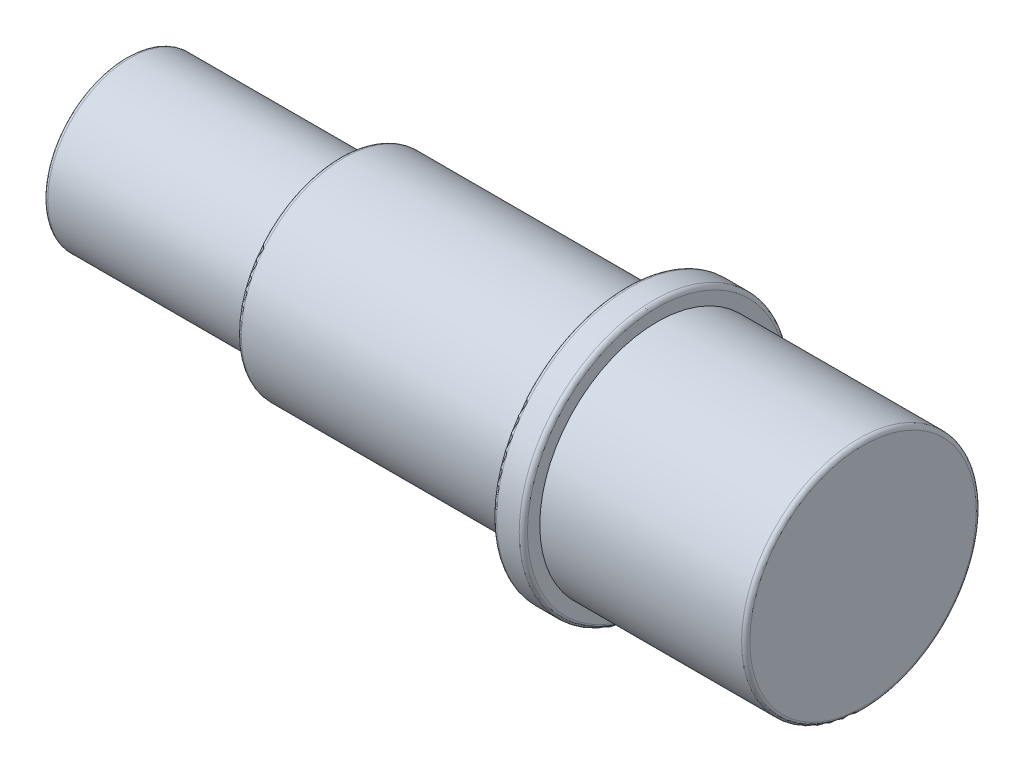
ISO-10303-21;
HEADER;
FILE_DESCRIPTION(('STEP AP214'),'2;1');
FILE_NAME('part.step','',(''),(''),'','','');
FILE_SCHEMA(('AUTOMOTIVE_DESIGN { 1 0 10303 214 1 1 1 1 }'));
ENDSEC;
DATA;
#1=APPLICATION_CONTEXT('core data for automotive mechanical design processes');
#2=APPLICATION_PROTOCOL_DEFINITION('international standard','automotive_design',2000,#1);
#3=PRODUCT_CONTEXT('',#1,'mechanical');
#4=PRODUCT('Part','Part','',(#3));
#5=PRODUCT_RELATED_PRODUCT_CATEGORY('part','',(#4));
#6=PRODUCT_DEFINITION_FORMATION('','',#4);
#7=PRODUCT_DEFINITION_CONTEXT('part definition',#1,'design');
#8=PRODUCT_DEFINITION('design','',#6,#7);
#9=PRODUCT_DEFINITION_SHAPE('','',#8);
#10=(LENGTH_UNIT() NAMED_UNIT(*) SI_UNIT(.MILLI.,.METRE.));
#11=(NAMED_UNIT(*) PLANE_ANGLE_UNIT() SI_UNIT($,.RADIAN.));
#12=(NAMED_UNIT(*) SI_UNIT($,.STERADIAN.) SOLID_ANGLE_UNIT());
#13=UNCERTAINTY_MEASURE_WITH_UNIT(LENGTH_MEASURE(1.E-05),#10,'distance_accuracy_value','');
#14=(GEOMETRIC_REPRESENTATION_CONTEXT(3) GLOBAL_UNCERTAINTY_ASSIGNED_CONTEXT((#13)) GLOBAL_UNIT_ASSIGNED_CONTEXT((#10,
#11,#12)) REPRESENTATION_CONTEXT('',''));
#15=CARTESIAN_POINT('',(0.,0.,0.));
#16=DIRECTION('',(0.,0.,1.));
#17=DIRECTION('',(1.,0.,0.));
#18=AXIS2_PLACEMENT_3D('',#15,#16,#17);
#19=CARTESIAN_POINT('',(0.,0.,0.));
#20=DIRECTION('',(1.,0.,0.));
#21=DIRECTION('',(0.,0.,-1.));
#22=AXIS2_PLACEMENT_3D('',#19,#20,#21);
#23=PLANE('',#22);
#24=CARTESIAN_POINT('',(0.,0.,0.));
#25=DIRECTION('',(1.,0.,0.));
#26=DIRECTION('',(0.,0.,-1.));
#27=AXIS2_PLACEMENT_3D('',#24,#25,#26);
#28=CIRCLE('',#27,19.);
#29=CARTESIAN_POINT('',(0.,0.,-19.));
#30=VERTEX_POINT('',#29);
#31=EDGE_CURVE('E59',#30,#30,#28,.F.);
#32=ORIENTED_EDGE('',*,*,#31,.T.);
#33=EDGE_LOOP('',(#32));
#34=FACE_BOUND('',#33,.T.);
#35=CARTESIAN_POINT('',(0.,0.,0.));
#36=DIRECTION('',(-1.,0.,0.));
#37=DIRECTION('',(0.,0.,1.));
#38=AXIS2_PLACEMENT_3D('',#35,#36,#37);
#39=CIRCLE('',#38,3.4);
#40=CARTESIAN_POINT('',(0.,0.,3.4));
#41=VERTEX_POINT('',#40);
#42=EDGE_CURVE('E74',#41,#41,#39,.T.);
#43=ORIENTED_EDGE('',*,*,#42,.F.);
#44=EDGE_LOOP('',(#43));
#45=FACE_BOUND('',#44,.T.);
#46=ADVANCED_FACE('F51',(#34,#45),#23,.F.);
#47=CARTESIAN_POINT('',(0.,0.,0.));
#48=DIRECTION('',(-1.,0.,0.));
#49=DIRECTION('',(0.,0.,1.));
#50=AXIS2_PLACEMENT_3D('',#47,#48,#49);
#51=CYLINDRICAL_SURFACE('',#50,20.);
#52=CARTESIAN_POINT('',(1.,0.,0.));
#53=DIRECTION('',(1.,0.,0.));
#54=DIRECTION('',(0.,0.,-1.));
#55=AXIS2_PLACEMENT_3D('',#52,#53,#54);
#56=CIRCLE('',#55,20.);
#57=CARTESIAN_POINT('',(1.,0.,-20.));
#58=VERTEX_POINT('',#57);
#59=EDGE_CURVE('E11',#58,#58,#56,.T.);
#60=ORIENTED_EDGE('',*,*,#59,.T.);
#61=EDGE_LOOP('',(#60));
#62=FACE_BOUND('',#61,.T.);
#63=CARTESIAN_POINT('',(52.,0.,0.));
#64=DIRECTION('',(-1.,0.,0.));
#65=DIRECTION('',(0.,0.,1.));
#66=AXIS2_PLACEMENT_3D('',#63,#64,#65);
#67=CIRCLE('',#66,20.);
#68=CARTESIAN_POINT('',(52.,0.,20.));
#69=VERTEX_POINT('',#68);
#70=EDGE_CURVE('E88',#69,#69,#67,.T.);
#71=ORIENTED_EDGE('',*,*,#70,.T.);
#72=EDGE_LOOP('',(#71));
#73=FACE_BOUND('',#72,.T.);
#74=ADVANCED_FACE('F140',(#62,#73),#51,.T.);
#75=CARTESIAN_POINT('',(52.,20.,0.));
#76=DIRECTION('',(1.,0.,0.));
#77=DIRECTION('',(0.,0.,-1.));
#78=AXIS2_PLACEMENT_3D('',#75,#76,#77);
#79=PLANE('',#78);
#80=CARTESIAN_POINT('',(52.,0.,0.));
#81=DIRECTION('',(1.,0.,0.));
#82=DIRECTION('',(0.,0.,-1.));
#83=AXIS2_PLACEMENT_3D('',#80,#81,#82);
#84=CIRCLE('',#83,24.);
#85=CARTESIAN_POINT('',(52.,0.,-24.));
#86=VERTEX_POINT('',#85);
#87=EDGE_CURVE('E116',#86,#86,#84,.F.);
#88=ORIENTED_EDGE('',*,*,#87,.T.);
#89=EDGE_LOOP('',(#88));
#90=FACE_BOUND('',#89,.T.);
#91=ORIENTED_EDGE('',*,*,#70,.F.);
#92=EDGE_LOOP('',(#91));
#93=FACE_BOUND('',#92,.T.);
#94=ADVANCED_FACE('F146',(#90,#93),#79,.F.);
#95=CARTESIAN_POINT('',(0.,0.,0.));
#96=DIRECTION('',(-1.,0.,0.));
#97=DIRECTION('',(0.,0.,1.));
#98=AXIS2_PLACEMENT_3D('',#95,#96,#97);
#99=CYLINDRICAL_SURFACE('',#98,25.);
#100=CARTESIAN_POINT('',(53.,0.,0.));
#101=DIRECTION('',(1.,0.,0.));
#102=DIRECTION('',(0.,0.,-1.));
#103=AXIS2_PLACEMENT_3D('',#100,#101,#102);
#104=CIRCLE('',#103,25.);
#105=CARTESIAN_POINT('',(53.,0.,-25.));
#106=VERTEX_POINT('',#105);
#107=EDGE_CURVE('E120',#106,#106,#104,.T.);
#108=ORIENTED_EDGE('',*,*,#107,.T.);
#109=EDGE_LOOP('',(#108));
#110=FACE_BOUND('',#109,.T.);
#111=CARTESIAN_POINT('',(121.5,0.,0.));
#112=DIRECTION('',(-1.,0.,0.));
#113=DIRECTION('',(0.,0.,1.));
#114=AXIS2_PLACEMENT_3D('',#111,#112,#113);
#115=CIRCLE('',#114,25.);
#116=CARTESIAN_POINT('',(121.5,0.,25.));
#117=VERTEX_POINT('',#116);
#118=EDGE_CURVE('E80',#117,#117,#115,.T.);
#119=ORIENTED_EDGE('',*,*,#118,.T.);
#120=EDGE_LOOP('',(#119));
#121=FACE_BOUND('',#120,.T.);
#122=ADVANCED_FACE('F171',(#110,#121),#99,.T.);
#123=CARTESIAN_POINT('',(121.5,25.,0.));
#124=DIRECTION('',(1.,0.,0.));
#125=DIRECTION('',(0.,0.,-1.));
#126=AXIS2_PLACEMENT_3D('',#123,#124,#125);
#127=PLANE('',#126);
#128=CARTESIAN_POINT('',(121.5,0.,0.));
#129=DIRECTION('',(1.,0.,0.));
#130=DIRECTION('',(0.,0.,-1.));
#131=AXIS2_PLACEMENT_3D('',#128,#129,#130);
#132=CIRCLE('',#131,31.5);
#133=CARTESIAN_POINT('',(121.5,0.,-31.5));
#134=VERTEX_POINT('',#133);
#135=EDGE_CURVE('E112',#134,#134,#132,.F.);
#136=ORIENTED_EDGE('',*,*,#135,.T.);
#137=EDGE_LOOP('',(#136));
#138=FACE_BOUND('',#137,.T.);
#139=ORIENTED_EDGE('',*,*,#118,.F.);
#140=EDGE_LOOP('',(#139));
#141=FACE_BOUND('',#140,.T.);
#142=ADVANCED_FACE('F167',(#138,#141),#127,.F.);
#143=CARTESIAN_POINT('',(0.,0.,0.));
#144=DIRECTION('',(-1.,0.,0.));
#145=DIRECTION('',(0.,0.,1.));
#146=AXIS2_PLACEMENT_3D('',#143,#144,#145);
#147=CYLINDRICAL_SURFACE('',#146,32.5);
#148=CARTESIAN_POINT('',(128.,0.,0.));
#149=DIRECTION('',(-1.,0.,0.));
#150=DIRECTION('',(0.,0.,1.));
#151=AXIS2_PLACEMENT_3D('',#148,#149,#150);
#152=CIRCLE('',#151,32.5);
#153=CARTESIAN_POINT('',(128.,0.,32.5));
#154=VERTEX_POINT('',#153);
#155=EDGE_CURVE('E104',#154,#154,#152,.T.);
#156=ORIENTED_EDGE('',*,*,#155,.T.);
#157=EDGE_LOOP('',(#156));
#158=FACE_BOUND('',#157,.T.);
#159=CARTESIAN_POINT('',(122.5,0.,0.));
#160=DIRECTION('',(1.,0.,0.));
#161=DIRECTION('',(0.,0.,-1.));
#162=AXIS2_PLACEMENT_3D('',#159,#160,#161);
#163=CIRCLE('',#162,32.5);
#164=CARTESIAN_POINT('',(122.5,0.,-32.5));
#165=VERTEX_POINT('',#164);
#166=EDGE_CURVE('E100',#165,#165,#163,.T.);
#167=ORIENTED_EDGE('',*,*,#166,.T.);
#168=EDGE_LOOP('',(#167));
#169=FACE_BOUND('',#168,.T.);
#170=ADVANCED_FACE('F170',(#158,#169),#147,.T.);
#171=CARTESIAN_POINT('',(129.,32.5,0.));
#172=DIRECTION('',(-1.,0.,0.));
#173=DIRECTION('',(0.,0.,1.));
#174=AXIS2_PLACEMENT_3D('',#171,#172,#173);
#175=PLANE('',#174);
#176=CARTESIAN_POINT('',(129.,0.,0.));
#177=DIRECTION('',(-1.,0.,0.));
#178=DIRECTION('',(0.,0.,1.));
#179=AXIS2_PLACEMENT_3D('',#176,#177,#178);
#180=CIRCLE('',#179,31.5);
#181=CARTESIAN_POINT('',(129.,0.,31.5));
#182=VERTEX_POINT('',#181);
#183=EDGE_CURVE('E108',#182,#182,#180,.F.);
#184=ORIENTED_EDGE('',*,*,#183,.T.);
#185=EDGE_LOOP('',(#184));
#186=FACE_BOUND('',#185,.T.);
#187=CARTESIAN_POINT('',(129.,0.,0.));
#188=DIRECTION('',(-1.,0.,0.));
#189=DIRECTION('',(0.,0.,1.));
#190=AXIS2_PLACEMENT_3D('',#187,#188,#189);
#191=CIRCLE('',#190,28.5);
#192=CARTESIAN_POINT('',(129.,0.,28.5));
#193=VERTEX_POINT('',#192);
#194=EDGE_CURVE('E73',#193,#193,#191,.T.);
#195=ORIENTED_EDGE('',*,*,#194,.T.);
#196=EDGE_LOOP('',(#195));
#197=FACE_BOUND('',#196,.T.);
#198=ADVANCED_FACE('F185',(#186,#197),#175,.F.);
#199=CARTESIAN_POINT('',(0.,0.,0.));
#200=DIRECTION('',(-1.,0.,0.));
#201=DIRECTION('',(0.,0.,1.));
#202=AXIS2_PLACEMENT_3D('',#199,#200,#201);
#203=CYLINDRICAL_SURFACE('',#202,28.5);
#204=CARTESIAN_POINT('',(178.,0.,0.));
#205=DIRECTION('',(-1.,0.,0.));
#206=DIRECTION('',(0.,0.,1.));
#207=AXIS2_PLACEMENT_3D('',#204,#205,#206);
#208=CIRCLE('',#207,28.5);
#209=CARTESIAN_POINT('',(178.,0.,28.5));
#210=VERTEX_POINT('',#209);
#211=EDGE_CURVE('E92',#210,#210,#208,.T.);
#212=ORIENTED_EDGE('',*,*,#211,.T.);
#213=EDGE_LOOP('',(#212));
#214=FACE_BOUND('',#213,.T.);
#215=ORIENTED_EDGE('',*,*,#194,.F.);
#216=EDGE_LOOP('',(#215));
#217=FACE_BOUND('',#216,.T.);
#218=ADVANCED_FACE('F189',(#214,#217),#203,.T.);
#219=CARTESIAN_POINT('',(179.,28.5,0.));
#220=DIRECTION('',(-1.,0.,0.));
#221=DIRECTION('',(0.,0.,1.));
#222=AXIS2_PLACEMENT_3D('',#219,#220,#221);
#223=PLANE('',#222);
#224=CARTESIAN_POINT('',(179.,0.,0.));
#225=DIRECTION('',(-1.,0.,0.));
#226=DIRECTION('',(0.,0.,1.));
#227=AXIS2_PLACEMENT_3D('',#224,#225,#226);
#228=CIRCLE('',#227,27.5);
#229=CARTESIAN_POINT('',(179.,0.,27.5));
#230=VERTEX_POINT('',#229);
#231=EDGE_CURVE('E96',#230,#230,#228,.F.);
#232=ORIENTED_EDGE('',*,*,#231,.T.);
#233=EDGE_LOOP('',(#232));
#234=FACE_BOUND('',#233,.T.);
#235=ADVANCED_FACE('F66',(#234),#223,.F.);
#236=CARTESIAN_POINT('',(22.25,0.,0.));
#237=DIRECTION('',(-1.,0.,0.));
#238=DIRECTION('',(0.,0.,1.));
#239=AXIS2_PLACEMENT_3D('',#236,#237,#238);
#240=CONICAL_SURFACE('',#239,3.39999999999999,1.02974425867665);
#241=CARTESIAN_POINT('',(24.2929261046937,0.,0.));
#242=VERTEX_POINT('',#241);
#243=VERTEX_LOOP('',#242);
#244=FACE_BOUND('',#243,.T.);
#245=CARTESIAN_POINT('',(22.25,0.,0.));
#246=DIRECTION('',(-1.,0.,0.));
#247=DIRECTION('',(0.,0.,1.));
#248=AXIS2_PLACEMENT_3D('',#245,#246,#247);
#249=CIRCLE('',#248,3.39999999999999);
#250=CARTESIAN_POINT('',(22.25,0.,3.39999999999999));
#251=VERTEX_POINT('',#250);
#252=EDGE_CURVE('E70',#251,#251,#249,.T.);
#253=ORIENTED_EDGE('',*,*,#252,.T.);
#254=EDGE_LOOP('',(#253));
#255=FACE_BOUND('',#254,.T.);
#256=ADVANCED_FACE('F62',(#244,#255),#240,.F.);
#257=CARTESIAN_POINT('',(0.,0.,0.));
#258=DIRECTION('',(-1.,0.,0.));
#259=DIRECTION('',(0.,0.,1.));
#260=AXIS2_PLACEMENT_3D('',#257,#258,#259);
#261=CYLINDRICAL_SURFACE('',#260,3.4);
#262=ORIENTED_EDGE('',*,*,#252,.F.);
#263=EDGE_LOOP('',(#262));
#264=FACE_BOUND('',#263,.T.);
#265=ORIENTED_EDGE('',*,*,#42,.T.);
#266=EDGE_LOOP('',(#265));
#267=FACE_BOUND('',#266,.T.);
#268=ADVANCED_FACE('F65',(#264,#267),#261,.F.);
#269=CARTESIAN_POINT('',(178.,0.,0.));
#270=DIRECTION('',(-1.,0.,0.));
#271=DIRECTION('',(0.,0.,1.));
#272=AXIS2_PLACEMENT_3D('',#269,#270,#271);
#273=TOROIDAL_SURFACE('',#272,27.5,1.);
#274=ORIENTED_EDGE('',*,*,#231,.F.);
#275=EDGE_LOOP('',(#274));
#276=FACE_BOUND('',#275,.T.);
#277=ORIENTED_EDGE('',*,*,#211,.F.);
#278=EDGE_LOOP('',(#277));
#279=FACE_BOUND('',#278,.T.);
#280=ADVANCED_FACE('F151',(#276,#279),#273,.T.);
#281=CARTESIAN_POINT('',(128.,0.,0.));
#282=DIRECTION('',(-1.,0.,0.));
#283=DIRECTION('',(0.,0.,1.));
#284=AXIS2_PLACEMENT_3D('',#281,#282,#283);
#285=TOROIDAL_SURFACE('',#284,31.5,1.);
#286=ORIENTED_EDGE('',*,*,#183,.F.);
#287=EDGE_LOOP('',(#286));
#288=FACE_BOUND('',#287,.T.);
#289=ORIENTED_EDGE('',*,*,#155,.F.);
#290=EDGE_LOOP('',(#289));
#291=FACE_BOUND('',#290,.T.);
#292=ADVANCED_FACE('F154',(#288,#291),#285,.T.);
#293=CARTESIAN_POINT('',(122.5,0.,0.));
#294=DIRECTION('',(1.,0.,0.));
#295=DIRECTION('',(0.,0.,-1.));
#296=AXIS2_PLACEMENT_3D('',#293,#294,#295);
#297=TOROIDAL_SURFACE('',#296,31.5,1.);
#298=ORIENTED_EDGE('',*,*,#166,.F.);
#299=EDGE_LOOP('',(#298));
#300=FACE_BOUND('',#299,.T.);
#301=ORIENTED_EDGE('',*,*,#135,.F.);
#302=EDGE_LOOP('',(#301));
#303=FACE_BOUND('',#302,.T.);
#304=ADVANCED_FACE('F136',(#300,#303),#297,.T.);
#305=CARTESIAN_POINT('',(53.,0.,0.));
#306=DIRECTION('',(1.,0.,0.));
#307=DIRECTION('',(0.,0.,-1.));
#308=AXIS2_PLACEMENT_3D('',#305,#306,#307);
#309=TOROIDAL_SURFACE('',#308,24.,1.);
#310=ORIENTED_EDGE('',*,*,#107,.F.);
#311=EDGE_LOOP('',(#310));
#312=FACE_BOUND('',#311,.T.);
#313=ORIENTED_EDGE('',*,*,#87,.F.);
#314=EDGE_LOOP('',(#313));
#315=FACE_BOUND('',#314,.T.);
#316=ADVANCED_FACE('F131',(#312,#315),#309,.T.);
#317=CARTESIAN_POINT('',(1.,0.,0.));
#318=DIRECTION('',(1.,0.,0.));
#319=DIRECTION('',(0.,0.,-1.));
#320=AXIS2_PLACEMENT_3D('',#317,#318,#319);
#321=TOROIDAL_SURFACE('',#320,19.,1.);
#322=ORIENTED_EDGE('',*,*,#59,.F.);
#323=EDGE_LOOP('',(#322));
#324=FACE_BOUND('',#323,.T.);
#325=ORIENTED_EDGE('',*,*,#31,.F.);
#326=EDGE_LOOP('',(#325));
#327=FACE_BOUND('',#326,.T.);
#328=ADVANCED_FACE('F53',(#324,#327),#321,.T.);
#329=CLOSED_SHELL('',(#46,#74,#94,#122,#142,#170,#198,#218,#235,#256,#268,#280,#292,#304,#316,#328));
#330=MANIFOLD_SOLID_BREP('B2',#329);
#331=ADVANCED_BREP_SHAPE_REPRESENTATION('',(#18,#330),#14);
#332=SHAPE_DEFINITION_REPRESENTATION(#9,#331);
ENDSEC;
END-ISO-10303-21;
